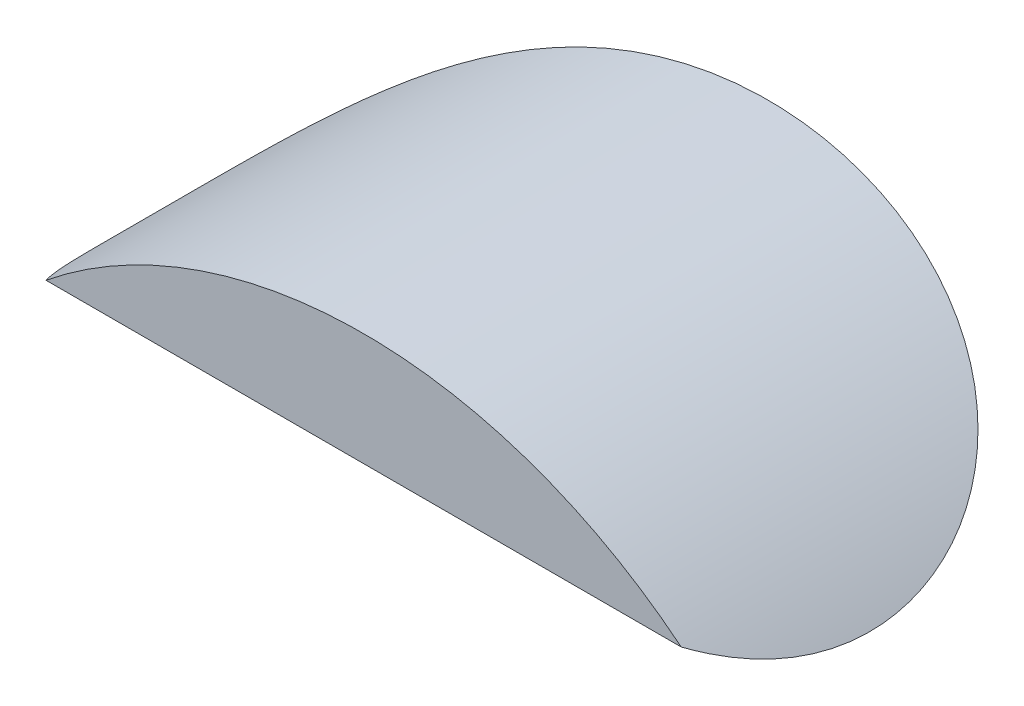
ISO-10303-21;
HEADER;
FILE_DESCRIPTION(('STEP AP214'),'2;1');
FILE_NAME('part.step','',(''),(''),'','','');
FILE_SCHEMA(('AUTOMOTIVE_DESIGN { 1 0 10303 214 1 1 1 1 }'));
ENDSEC;
DATA;
#1=APPLICATION_CONTEXT('core data for automotive mechanical design processes');
#2=APPLICATION_PROTOCOL_DEFINITION('international standard','automotive_design',2000,#1);
#3=PRODUCT_CONTEXT('',#1,'mechanical');
#4=PRODUCT('Part','Part','',(#3));
#5=PRODUCT_RELATED_PRODUCT_CATEGORY('part','',(#4));
#6=PRODUCT_DEFINITION_FORMATION('','',#4);
#7=PRODUCT_DEFINITION_CONTEXT('part definition',#1,'design');
#8=PRODUCT_DEFINITION('design','',#6,#7);
#9=PRODUCT_DEFINITION_SHAPE('','',#8);
#10=(LENGTH_UNIT() NAMED_UNIT(*) SI_UNIT(.MILLI.,.METRE.));
#11=(NAMED_UNIT(*) PLANE_ANGLE_UNIT() SI_UNIT($,.RADIAN.));
#12=(NAMED_UNIT(*) SI_UNIT($,.STERADIAN.) SOLID_ANGLE_UNIT());
#13=UNCERTAINTY_MEASURE_WITH_UNIT(LENGTH_MEASURE(1.E-05),#10,'distance_accuracy_value','');
#14=(GEOMETRIC_REPRESENTATION_CONTEXT(3) GLOBAL_UNCERTAINTY_ASSIGNED_CONTEXT((#13)) GLOBAL_UNIT_ASSIGNED_CONTEXT((#10,
#11,#12)) REPRESENTATION_CONTEXT('',''));
#15=CARTESIAN_POINT('',(0.,0.,0.));
#16=DIRECTION('',(0.,0.,1.));
#17=DIRECTION('',(1.,0.,0.));
#18=AXIS2_PLACEMENT_3D('',#15,#16,#17);
#19=CARTESIAN_POINT('',(60.,0.,0.));
#20=DIRECTION('',(-1.,0.,0.));
#21=DIRECTION('',(0.,0.,1.));
#22=AXIS2_PLACEMENT_3D('',#19,#20,#21);
#23=CYLINDRICAL_SURFACE('',#22,11.75);
#24=DIRECTION('',(-1.,0.,0.));
#25=VECTOR('',#24,1.);
#26=CARTESIAN_POINT('',(60.,-10.2187327981507,5.8));
#27=LINE('',#26,#25);
#28=CARTESIAN_POINT('',(42.600783273462,-10.2187327981507,5.8));
#29=VERTEX_POINT('',#28);
#30=CARTESIAN_POINT('',(17.399216726538,-10.2187327981507,5.8));
#31=VERTEX_POINT('',#30);
#32=EDGE_CURVE('E40',#29,#31,#27,.T.);
#33=ORIENTED_EDGE('',*,*,#32,.T.);
#34=CARTESIAN_POINT('',(17.399216726538,-10.2187327981507,5.8));
#35=CARTESIAN_POINT('',(17.2723538024059,-10.3216539742075,5.61874079141168));
#36=CARTESIAN_POINT('',(17.1521935437816,-10.4217251463093,5.43112322969222));
#37=CARTESIAN_POINT('',(16.9256912317893,-10.6144612008835,5.04403136772688));
#38=CARTESIAN_POINT('',(16.8193532562725,-10.7071238946165,4.84455359366209));
#39=CARTESIAN_POINT('',(16.6209144034257,-10.8833355195668,4.43456610471029));
#40=CARTESIAN_POINT('',(16.5288235099056,-10.9668780477618,4.22404879082114));
#41=CARTESIAN_POINT('',(16.3592655825486,-11.1231867771802,3.79337199384964));
#42=CARTESIAN_POINT('',(16.2817967396675,-11.1959543112486,3.5732137077088));
#43=CARTESIAN_POINT('',(16.1414881425113,-11.3294916211796,3.12412052719145));
#44=CARTESIAN_POINT('',(16.0786834551994,-11.3902325858181,2.89516608903073));
#45=CARTESIAN_POINT('',(15.9680376975624,-11.4983326071618,2.43058112682649));
#46=CARTESIAN_POINT('',(15.9201962482771,-11.545692002767,2.19495077202266));
#47=CARTESIAN_POINT('',(15.8395459707584,-11.6260916669029,1.71892730529135));
#48=CARTESIAN_POINT('',(15.8067249048496,-11.6591435910804,1.47853823767199));
#49=CARTESIAN_POINT('',(15.7560650374676,-11.7103554510713,0.994620576303129));
#50=CARTESIAN_POINT('',(15.7382256993571,-11.728515920288,0.751092095323002));
#51=CARTESIAN_POINT('',(15.717798923285,-11.7493237417421,0.269244496429815));
#52=CARTESIAN_POINT('',(15.71481836912,-11.7523709319807,0.0309591410868846));
#53=CARTESIAN_POINT('',(15.7230457472063,-11.7439794172347,-0.445109194813194));
#54=CARTESIAN_POINT('',(15.7342534793996,-11.7325409165014,-0.682892182406487));
#55=CARTESIAN_POINT('',(15.770865404239,-11.6953777541158,-1.15629969672211));
#56=CARTESIAN_POINT('',(15.7962733160932,-11.6696493497664,-1.39192364152412));
#57=CARTESIAN_POINT('',(15.8612887115942,-11.6043659944541,-1.85926225857269));
#58=CARTESIAN_POINT('',(15.9008961655538,-11.5648110723986,-2.09097693899139));
#59=CARTESIAN_POINT('',(15.9939408006419,-11.472936536206,-2.547146406506));
#60=CARTESIAN_POINT('',(16.0472717858102,-11.4207151092016,-2.77164267308109));
#61=CARTESIAN_POINT('',(16.1678441586419,-11.3042919625114,-3.21367716721157));
#62=CARTESIAN_POINT('',(16.2350853667419,-11.2400903974751,-3.4312154845434));
#63=CARTESIAN_POINT('',(16.3833423639289,-11.1008715514558,-3.85791472404029));
#64=CARTESIAN_POINT('',(16.4643552480826,-11.0258565519145,-4.06707740145123));
#65=CARTESIAN_POINT('',(16.6399593929259,-10.8663385805744,-4.47586075128066));
#66=CARTESIAN_POINT('',(16.7345509169338,-10.7818354247872,-4.67548123855592));
#67=CARTESIAN_POINT('',(16.9398699732554,-10.6023232548784,-5.06966084040063));
#68=CARTESIAN_POINT('',(17.0509784468428,-10.5070845763486,-5.26391676873681));
#69=CARTESIAN_POINT('',(17.2867643247499,-10.3098817739795,-5.64039026887686));
#70=CARTESIAN_POINT('',(17.4114418819536,-10.2079175743683,-5.82260770500487));
#71=CARTESIAN_POINT('',(17.673791995154,-9.99904120174348,-6.17442597094803));
#72=CARTESIAN_POINT('',(17.8114657495514,-9.89212857289137,-6.34402563467422));
#73=CARTESIAN_POINT('',(18.0991133023626,-9.67513276607162,-6.67028509241728));
#74=CARTESIAN_POINT('',(18.2490886067264,-9.56504920099294,-6.826943297421));
#75=CARTESIAN_POINT('',(18.5747269299933,-9.33334389419963,-7.14091364395608));
#76=CARTESIAN_POINT('',(18.7514855374552,-9.21158403331962,-7.296987178134));
#77=CARTESIAN_POINT('',(19.1175896614118,-8.96841945634744,-7.59386481634509));
#78=CARTESIAN_POINT('',(19.3069356397637,-8.84701475345758,-7.7346683595907));
#79=CARTESIAN_POINT('',(19.6971815450597,-8.6063568552768,-8.00158975683401));
#80=CARTESIAN_POINT('',(19.8980880068691,-8.48710492793723,-8.12769918031845));
#81=CARTESIAN_POINT('',(20.3102243110911,-8.25244198645476,-8.36586226368493));
#82=CARTESIAN_POINT('',(20.5214560536637,-8.13703168590483,-8.4779133227728));
#83=CARTESIAN_POINT('',(21.0569595582682,-7.85721081361619,-8.73951273545936));
#84=CARTESIAN_POINT('',(21.3867444706715,-7.69592451316356,-8.88118215606752));
#85=CARTESIAN_POINT('',(22.0631306402219,-7.38851059651934,-9.13852420901339));
#86=CARTESIAN_POINT('',(22.409738426979,-7.24238893649586,-9.25418664732186));
#87=CARTESIAN_POINT('',(23.1171026657573,-6.9678313441376,-9.46264106551033));
#88=CARTESIAN_POINT('',(23.4778776267332,-6.83941960851379,-9.5554018893763));
#89=CARTESIAN_POINT('',(24.2103454970236,-6.60246496068366,-9.72063865921336));
#90=CARTESIAN_POINT('',(24.582037490436,-6.49392038718392,-9.7931163015338));
#91=CARTESIAN_POINT('',(25.3407398840837,-6.29626646462436,-9.92137392401884));
#92=CARTESIAN_POINT('',(25.7279057594725,-6.20754422818043,-9.97682811835753));
#93=CARTESIAN_POINT('',(26.5087469723856,-6.05305670410818,-10.0713055797971));
#94=CARTESIAN_POINT('',(26.9024223813553,-5.98729166862218,-10.1103286664337));
#95=CARTESIAN_POINT('',(27.6941771187314,-5.87934785011599,-10.1734793225127));
#96=CARTESIAN_POINT('',(28.0922565507942,-5.83716962346265,-10.197606540592));
#97=CARTESIAN_POINT('',(28.8908341335786,-5.77676441125244,-10.231944023125));
#98=CARTESIAN_POINT('',(29.2913324597861,-5.75853918492334,-10.242153265375));
#99=CARTESIAN_POINT('',(30.1682748072526,-5.74504047815205,-10.2497398679448));
#100=CARTESIAN_POINT('',(30.6448295768342,-5.75473079830627,-10.244341358975));
#101=CARTESIAN_POINT('',(31.5954980628748,-5.80805682926822,-10.214200678029));
#102=CARTESIAN_POINT('',(32.0696113360596,-5.85169849968345,-10.1894551099875));
#103=CARTESIAN_POINT('',(33.0121227257852,-5.9724148822678,-10.1191721881202));
#104=CARTESIAN_POINT('',(33.480519692368,-6.04949621116526,-10.0736307193014));
#105=CARTESIAN_POINT('',(34.4078776813629,-6.23605253749727,-9.95922459212218));
#106=CARTESIAN_POINT('',(34.8668409569238,-6.34551970142741,-9.89036557324248));
#107=CARTESIAN_POINT('',(35.684892141913,-6.57120759803929,-9.74147116606179));
#108=CARTESIAN_POINT('',(36.0462968162823,-6.68213464178277,-9.66609044675636));
#109=CARTESIAN_POINT('',(36.7580601031147,-6.92263552797836,-9.49533509070473));
#110=CARTESIAN_POINT('',(37.1084190811251,-7.05220875256104,-9.39996111641748));
#111=CARTESIAN_POINT('',(37.7949071232859,-7.32783881796014,-9.18670700798919));
#112=CARTESIAN_POINT('',(38.1310573101872,-7.47386991587569,-9.06886182817603));
#113=CARTESIAN_POINT('',(38.78671442143,-7.7799026984108,-8.80772680254573));
#114=CARTESIAN_POINT('',(39.1062254055346,-7.93990094947626,-8.66444320136831));
#115=CARTESIAN_POINT('',(39.6569208054199,-8.23375908172653,-8.38446543131289));
#116=CARTESIAN_POINT('',(39.8920197144396,-8.36558069524757,-8.25331358678696));
#117=CARTESIAN_POINT('',(40.348516558865,-8.63339480698336,-7.97274052073614));
#118=CARTESIAN_POINT('',(40.5699176585704,-8.76938633097835,-7.82332354251067));
#119=CARTESIAN_POINT('',(40.9973665723831,-9.04304547392306,-7.50531870663285));
#120=CARTESIAN_POINT('',(41.2034168423071,-9.1807128206582,-7.33673392638247));
#121=CARTESIAN_POINT('',(41.5985817589172,-9.45488607733755,-6.97984575317843));
#122=CARTESIAN_POINT('',(41.7876961800123,-9.59139197178893,-6.79154209763553));
#123=CARTESIAN_POINT('',(42.1490598364761,-9.86127248240084,-6.39344367090346));
#124=CARTESIAN_POINT('',(42.3211454209764,-9.99460880993516,-6.1834738273679));
#125=CARTESIAN_POINT('',(42.6451831788494,-10.2534722688621,-5.74402434410216));
#126=CARTESIAN_POINT('',(42.7971347916171,-10.37899918276,-5.51454416142327));
#127=CARTESIAN_POINT('',(43.0797414784794,-10.6187504989172,-5.03744656703538));
#128=CARTESIAN_POINT('',(43.2104071972321,-10.7329805392219,-4.78983831117233));
#129=CARTESIAN_POINT('',(43.4497380624402,-10.9469481200556,-4.27827578978248));
#130=CARTESIAN_POINT('',(43.5584069566122,-11.04668812851,-4.0143243187608));
#131=CARTESIAN_POINT('',(43.7392309239156,-11.2156762957222,-3.5115516054215));
#132=CARTESIAN_POINT('',(43.814390525217,-11.2872470368218,-3.27458389525952));
#133=CARTESIAN_POINT('',(43.9480831278463,-11.4161375950309,-2.79223786437087));
#134=CARTESIAN_POINT('',(44.0066178071221,-11.4734588502632,-2.54686039524187));
#135=CARTESIAN_POINT('',(44.1069767319628,-11.5726169548411,-2.04970244943415));
#136=CARTESIAN_POINT('',(44.1488046297664,-11.6144571883168,-1.79792338501152));
#137=CARTESIAN_POINT('',(44.2157486891985,-11.6817821577391,-1.28999376610124));
#138=CARTESIAN_POINT('',(44.2408654531589,-11.7072674831769,-1.03384336951416));
#139=CARTESIAN_POINT('',(44.2731391405687,-11.7400758278434,-0.538562133566252));
#140=CARTESIAN_POINT('',(44.2814968735584,-11.7486127175874,-0.299588323792169));
#141=CARTESIAN_POINT('',(44.2839110386579,-11.7510753054246,0.178498183079624));
#142=CARTESIAN_POINT('',(44.2779683156331,-11.7450018666905,0.417610871138053));
#143=CARTESIAN_POINT('',(44.2517839184526,-11.7183571526177,0.894175519239865));
#144=CARTESIAN_POINT('',(44.2315459363911,-11.6977896207302,1.13162789211094));
#145=CARTESIAN_POINT('',(44.1767723725628,-11.6425326314426,1.60321344968077));
#146=CARTESIAN_POINT('',(44.1422369650817,-11.6078433461868,1.83734667480398));
#147=CARTESIAN_POINT('',(44.059356886054,-11.5254489690028,2.29796394044819));
#148=CARTESIAN_POINT('',(44.0111752599582,-11.4778978358798,2.52450493143825));
#149=CARTESIAN_POINT('',(43.9008870759413,-11.3704569032098,2.97119208687118));
#150=CARTESIAN_POINT('',(43.8387796826912,-11.3105663635082,3.19133786680591));
#151=CARTESIAN_POINT('',(43.7007542184291,-11.179537523013,3.62373566014301));
#152=CARTESIAN_POINT('',(43.6248398735126,-11.1084022575207,3.83598978470551));
#153=CARTESIAN_POINT('',(43.4593883079849,-10.956166985886,4.25133264596966));
#154=CARTESIAN_POINT('',(43.3698550402412,-10.875069872462,4.45442402003696));
#155=CARTESIAN_POINT('',(43.1750848226078,-10.7022601891355,4.85518672126209));
#156=CARTESIAN_POINT('',(43.0695207403942,-10.6103384910977,5.05260856464558));
#157=CARTESIAN_POINT('',(42.8450604759153,-10.4194386619615,5.43540707866283));
#158=CARTESIAN_POINT('',(42.7261961147403,-10.3204775711241,5.6208108909546));
#159=CARTESIAN_POINT('',(42.600783273462,-10.2187327981507,5.8));
#160=B_SPLINE_CURVE_WITH_KNOTS('',3,(#34,#35,#36,#37,#38,#39,#40,#41,#42,#43,#44,#45,#46,#47,
#48,#49,#50,#51,#52,#53,#54,#55,#56,#57,#58,#59,#60,#61,#62,#63,#64,#65,#66,#67,#68,#69,#70,#71,
#72,#73,#74,#75,#76,#77,#78,#79,#80,#81,#82,#83,#84,#85,#86,#87,#88,#89,#90,#91,#92,#93,#94,#95,
#96,#97,#98,#99,#100,#101,#102,#103,#104,#105,#106,#107,#108,#109,#110,#111,#112,#113,#114,#115,
#116,#117,#118,#119,#120,#121,#122,#123,#124,#125,#126,#127,#128,#129,#130,#131,#132,#133,#134,
#135,#136,#137,#138,#139,#140,#141,#142,#143,#144,#145,#146,#147,#148,#149,#150,#151,#152,#153,
#154,#155,#156,#157,#158,#159),.UNSPECIFIED.,.F.,.F.,(4,2,2,2,2,2,2,2,2,2,2,2,2,2,2,2,2,2,2,2,2,
2,2,2,2,2,2,2,2,2,2,2,2,2,2,2,2,2,2,2,2,2,2,2,2,2,2,2,2,2,2,2,2,2,2,2,2,2,2,2,2,2,4),(0.,
0.731902311738108,1.46402006163069,2.19664855015704,2.92918633818185,3.66345833021842,
4.39771172451415,5.1313658250472,5.86499364536607,6.57910501339136,7.29320631239847,
8.00749473134587,8.72178165692163,9.43069929409756,10.1396077806179,10.848366918411,
11.5571398023925,12.2859742225483,13.0148168553918,13.7437267617835,14.472726034546,
15.2680859307398,16.0634750264929,16.8593182399684,17.655308467837,18.8340667786243,
20.0132863282465,21.1941013899492,22.374817666662,23.5768935253657,24.77898258623,
25.9811000008366,27.1833057000066,28.6117164391526,30.0403779691678,31.4693223184567,
32.8979213160539,34.0533555142215,35.2087514341407,36.3623645653756,37.5156948975097,
38.4141295812974,39.3123559387719,40.2104382885686,41.1085325993294,42.0145564710062,
42.9206055644688,43.8262001603198,44.731640335071,45.506715143834,46.2817116967338,
47.0565387362194,47.8313378465173,48.5482941852217,49.2652081674644,49.9819370571115,
50.6986572100837,51.4071511991804,52.1156876982461,52.8240332668385,53.532173630349,
54.2574221940717,54.9809712659506),.UNSPECIFIED.);
#161=EDGE_CURVE('E46',#31,#29,#160,.T.);
#162=ORIENTED_EDGE('',*,*,#161,.T.);
#163=EDGE_LOOP('',(#33,#162));
#164=FACE_BOUND('',#163,.T.);
#165=ADVANCED_FACE('F32',(#164),#23,.T.);
#166=CARTESIAN_POINT('',(60.,10.2187327981507,5.8));
#167=DIRECTION('',(0.,0.,-1.));
#168=DIRECTION('',(-1.,0.,0.));
#169=AXIS2_PLACEMENT_3D('',#166,#167,#168);
#170=PLANE('',#169);
#171=ORIENTED_EDGE('',*,*,#32,.F.);
#172=CARTESIAN_POINT('',(30.,-25.75,5.8));
#173=DIRECTION('',(0.,0.,-1.));
#174=DIRECTION('',(-1.,0.,0.));
#175=AXIS2_PLACEMENT_3D('',#172,#173,#174);
#176=CIRCLE('',#175,20.);
#177=EDGE_CURVE('E11',#29,#31,#176,.F.);
#178=ORIENTED_EDGE('',*,*,#177,.T.);
#179=EDGE_LOOP('',(#171,#178));
#180=FACE_BOUND('',#179,.T.);
#181=ADVANCED_FACE('F53',(#180),#170,.F.);
#182=CARTESIAN_POINT('',(30.,-25.75,-11.75));
#183=DIRECTION('',(0.,0.,1.));
#184=DIRECTION('',(1.,0.,0.));
#185=AXIS2_PLACEMENT_3D('',#182,#183,#184);
#186=CYLINDRICAL_SURFACE('',#185,20.);
#187=ORIENTED_EDGE('',*,*,#177,.F.);
#188=ORIENTED_EDGE('',*,*,#161,.F.);
#189=EDGE_LOOP('',(#187,#188));
#190=FACE_BOUND('',#189,.T.);
#191=ADVANCED_FACE('F51',(#190),#186,.T.);
#192=CLOSED_SHELL('',(#165,#181,#191));
#193=MANIFOLD_SOLID_BREP('B2',#192);
#194=ADVANCED_BREP_SHAPE_REPRESENTATION('',(#18,#193),#14);
#195=SHAPE_DEFINITION_REPRESENTATION(#9,#194);
ENDSEC;
END-ISO-10303-21;
